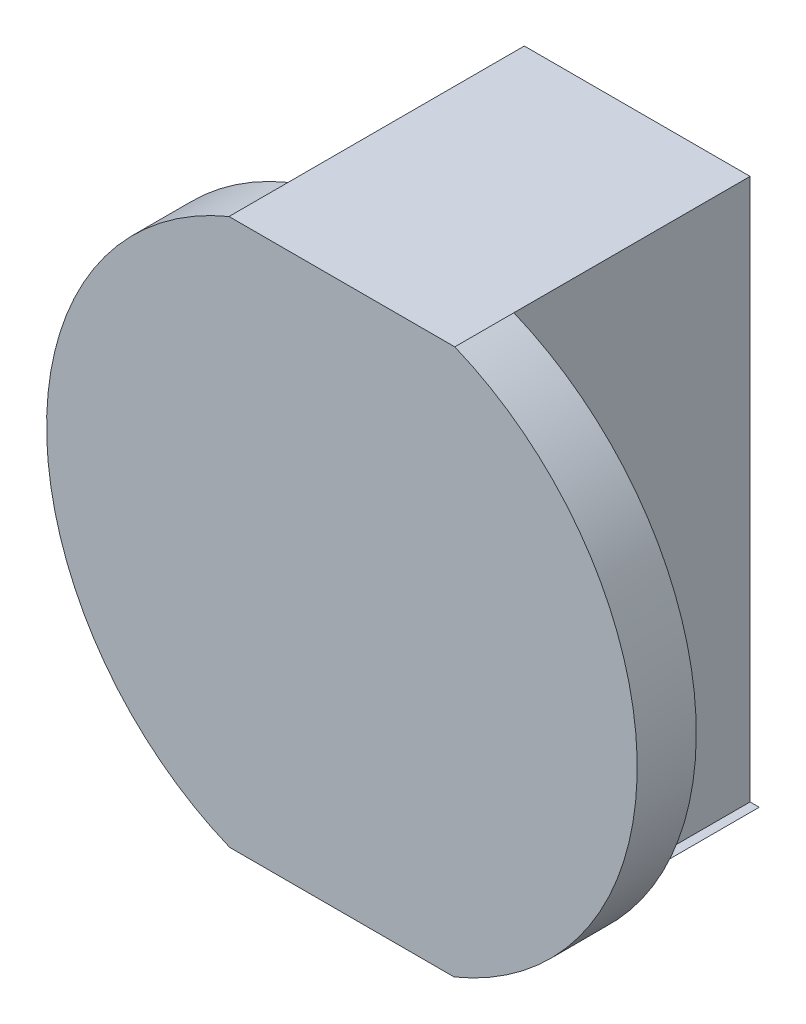
ISO-10303-21;
HEADER;
FILE_DESCRIPTION(('STEP AP214'),'2;1');
FILE_NAME('part.step','',(''),(''),'','','');
FILE_SCHEMA(('AUTOMOTIVE_DESIGN { 1 0 10303 214 1 1 1 1 }'));
ENDSEC;
DATA;
#1=APPLICATION_CONTEXT('core data for automotive mechanical design processes');
#2=APPLICATION_PROTOCOL_DEFINITION('international standard','automotive_design',2000,#1);
#3=PRODUCT_CONTEXT('',#1,'mechanical');
#4=PRODUCT('Part','Part','',(#3));
#5=PRODUCT_RELATED_PRODUCT_CATEGORY('part','',(#4));
#6=PRODUCT_DEFINITION_FORMATION('','',#4);
#7=PRODUCT_DEFINITION_CONTEXT('part definition',#1,'design');
#8=PRODUCT_DEFINITION('design','',#6,#7);
#9=PRODUCT_DEFINITION_SHAPE('','',#8);
#10=(LENGTH_UNIT() NAMED_UNIT(*) SI_UNIT(.MILLI.,.METRE.));
#11=(NAMED_UNIT(*) PLANE_ANGLE_UNIT() SI_UNIT($,.RADIAN.));
#12=(NAMED_UNIT(*) SI_UNIT($,.STERADIAN.) SOLID_ANGLE_UNIT());
#13=UNCERTAINTY_MEASURE_WITH_UNIT(LENGTH_MEASURE(1.E-05),#10,'distance_accuracy_value','');
#14=(GEOMETRIC_REPRESENTATION_CONTEXT(3) GLOBAL_UNCERTAINTY_ASSIGNED_CONTEXT((#13)) GLOBAL_UNIT_ASSIGNED_CONTEXT((#10,
#11,#12)) REPRESENTATION_CONTEXT('',''));
#15=CARTESIAN_POINT('',(0.,0.,0.));
#16=DIRECTION('',(0.,0.,1.));
#17=DIRECTION('',(1.,0.,0.));
#18=AXIS2_PLACEMENT_3D('',#15,#16,#17);
#19=CARTESIAN_POINT('',(0.,0.,57.7));
#20=DIRECTION('',(0.,0.,-1.));
#21=DIRECTION('',(-1.,0.,0.));
#22=AXIS2_PLACEMENT_3D('',#19,#20,#21);
#23=CYLINDRICAL_SURFACE('',#22,50.);
#24=CARTESIAN_POINT('',(0.,0.,50.));
#25=DIRECTION('',(0.,0.,1.));
#26=DIRECTION('',(0.,-1.,0.));
#27=AXIS2_PLACEMENT_3D('',#24,#25,#26);
#28=CIRCLE('',#27,50.);
#29=CARTESIAN_POINT('',(-19.114065052816,46.2022999119819,50.));
#30=VERTEX_POINT('',#29);
#31=CARTESIAN_POINT('',(-18.9983551919633,-46.25,50.));
#32=VERTEX_POINT('',#31);
#33=EDGE_CURVE('E102',#30,#32,#28,.T.);
#34=ORIENTED_EDGE('',*,*,#33,.F.);
#35=DIRECTION('',(0.,0.,-1.));
#36=VECTOR('',#35,1.);
#37=CARTESIAN_POINT('',(-19.114065052816,46.2022999119819,57.7));
#38=LINE('',#37,#36);
#39=CARTESIAN_POINT('',(-19.114065052816,46.2022999119819,40.));
#40=VERTEX_POINT('',#39);
#41=EDGE_CURVE('E60',#30,#40,#38,.T.);
#42=ORIENTED_EDGE('',*,*,#41,.T.);
#43=CARTESIAN_POINT('',(0.,0.,40.));
#44=DIRECTION('',(0.,0.,-1.));
#45=DIRECTION('',(-1.,0.,0.));
#46=AXIS2_PLACEMENT_3D('',#43,#44,#45);
#47=CIRCLE('',#46,50.);
#48=CARTESIAN_POINT('',(-19.114065052816,-46.2022999119819,40.));
#49=VERTEX_POINT('',#48);
#50=EDGE_CURVE('E46',#49,#40,#47,.T.);
#51=ORIENTED_EDGE('',*,*,#50,.F.);
#52=DIRECTION('',(0.,0.,-1.));
#53=VECTOR('',#52,1.);
#54=CARTESIAN_POINT('',(-19.114065052816,-46.2022999119819,57.7));
#55=LINE('',#54,#53);
#56=CARTESIAN_POINT('',(-19.114065052816,-46.2022999119818,0.));
#57=VERTEX_POINT('',#56);
#58=EDGE_CURVE('E141',#49,#57,#55,.T.);
#59=ORIENTED_EDGE('',*,*,#58,.T.);
#60=CARTESIAN_POINT('',(0.,0.,0.));
#61=DIRECTION('',(0.,0.,1.));
#62=DIRECTION('',(1.,0.,0.));
#63=AXIS2_PLACEMENT_3D('',#60,#61,#62);
#64=CIRCLE('',#63,50.);
#65=CARTESIAN_POINT('',(-18.9983551919633,-46.25,0.));
#66=VERTEX_POINT('',#65);
#67=EDGE_CURVE('E119',#57,#66,#64,.T.);
#68=ORIENTED_EDGE('',*,*,#67,.T.);
#69=DIRECTION('',(0.,0.,-1.));
#70=VECTOR('',#69,1.);
#71=CARTESIAN_POINT('',(-18.9983551919633,-46.25,57.7));
#72=LINE('',#71,#70);
#73=EDGE_CURVE('E109',#32,#66,#72,.T.);
#74=ORIENTED_EDGE('',*,*,#73,.F.);
#75=EDGE_LOOP('',(#34,#42,#51,#59,#68,#74));
#76=FACE_BOUND('',#75,.T.);
#77=ADVANCED_FACE('F39',(#76),#23,.T.);
#78=CARTESIAN_POINT('',(0.,0.,50.));
#79=DIRECTION('',(0.,0.,1.));
#80=DIRECTION('',(0.,-1.,0.));
#81=AXIS2_PLACEMENT_3D('',#78,#79,#80);
#82=CIRCLE('',#81,50.);
#83=CARTESIAN_POINT('',(18.9983551919633,-46.25,50.));
#84=VERTEX_POINT('',#83);
#85=CARTESIAN_POINT('',(19.114065052816,46.2022999119819,50.));
#86=VERTEX_POINT('',#85);
#87=EDGE_CURVE('E52',#84,#86,#82,.T.);
#88=ORIENTED_EDGE('',*,*,#87,.F.);
#89=DIRECTION('',(0.,0.,-1.));
#90=VECTOR('',#89,1.);
#91=CARTESIAN_POINT('',(18.9983551919633,-46.25,57.7));
#92=LINE('',#91,#90);
#93=CARTESIAN_POINT('',(18.9983551919633,-46.25,0.));
#94=VERTEX_POINT('',#93);
#95=EDGE_CURVE('E157',#94,#84,#92,.F.);
#96=ORIENTED_EDGE('',*,*,#95,.F.);
#97=CARTESIAN_POINT('',(20.6641745876785,-45.5301206742299,0.));
#98=VERTEX_POINT('',#97);
#99=EDGE_CURVE('E115',#94,#98,#64,.T.);
#100=ORIENTED_EDGE('',*,*,#99,.T.);
#101=DIRECTION('',(0.,0.,-1.));
#102=VECTOR('',#101,1.);
#103=CARTESIAN_POINT('',(20.6641745876785,-45.5301206742299,57.7));
#104=LINE('',#103,#102);
#105=CARTESIAN_POINT('',(20.6641745876785,-45.5301206742299,40.));
#106=VERTEX_POINT('',#105);
#107=EDGE_CURVE('E145',#98,#106,#104,.F.);
#108=ORIENTED_EDGE('',*,*,#107,.T.);
#109=CARTESIAN_POINT('',(0.,0.,40.));
#110=DIRECTION('',(0.,0.,1.));
#111=DIRECTION('',(1.,0.,0.));
#112=AXIS2_PLACEMENT_3D('',#109,#110,#111);
#113=CIRCLE('',#112,50.);
#114=CARTESIAN_POINT('',(19.114065052816,46.2022999119819,40.));
#115=VERTEX_POINT('',#114);
#116=EDGE_CURVE('E133',#106,#115,#113,.T.);
#117=ORIENTED_EDGE('',*,*,#116,.T.);
#118=DIRECTION('',(0.,0.,-1.));
#119=VECTOR('',#118,1.);
#120=CARTESIAN_POINT('',(19.114065052816,46.2022999119819,57.7));
#121=LINE('',#120,#119);
#122=EDGE_CURVE('E121',#115,#86,#121,.F.);
#123=ORIENTED_EDGE('',*,*,#122,.T.);
#124=EDGE_LOOP('',(#88,#96,#100,#108,#117,#123));
#125=FACE_BOUND('',#124,.T.);
#126=ADVANCED_FACE('F159',(#125),#23,.T.);
#127=CARTESIAN_POINT('',(-53.3744857867374,-46.25,0.));
#128=DIRECTION('',(0.,-1.,0.));
#129=DIRECTION('',(0.,0.,-1.));
#130=AXIS2_PLACEMENT_3D('',#127,#128,#129);
#131=PLANE('',#130);
#132=ORIENTED_EDGE('',*,*,#95,.T.);
#133=DIRECTION('',(-1.,0.,0.));
#134=VECTOR('',#133,1.);
#135=CARTESIAN_POINT('',(-53.3744857867374,-46.25,50.));
#136=LINE('',#135,#134);
#137=EDGE_CURVE('E177',#84,#32,#136,.T.);
#138=ORIENTED_EDGE('',*,*,#137,.T.);
#139=ORIENTED_EDGE('',*,*,#73,.T.);
#140=DIRECTION('',(1.,0.,0.));
#141=VECTOR('',#140,1.);
#142=CARTESIAN_POINT('',(0.,-46.25,0.));
#143=LINE('',#142,#141);
#144=EDGE_CURVE('E125',#66,#94,#143,.T.);
#145=ORIENTED_EDGE('',*,*,#144,.T.);
#146=EDGE_LOOP('',(#132,#138,#139,#145));
#147=FACE_BOUND('',#146,.T.);
#148=ADVANCED_FACE('F156',(#147),#131,.T.);
#149=CARTESIAN_POINT('',(-43.6629237714477,46.2022999119819,0.));
#150=DIRECTION('',(0.,-1.,0.));
#151=DIRECTION('',(0.,0.,-1.));
#152=AXIS2_PLACEMENT_3D('',#149,#150,#151);
#153=PLANE('',#152);
#154=DIRECTION('',(-1.,0.,0.));
#155=VECTOR('',#154,1.);
#156=CARTESIAN_POINT('',(-43.6629237714477,46.2022999119819,50.));
#157=LINE('',#156,#155);
#158=EDGE_CURVE('E11',#86,#30,#157,.T.);
#159=ORIENTED_EDGE('',*,*,#158,.F.);
#160=ORIENTED_EDGE('',*,*,#122,.F.);
#161=CARTESIAN_POINT('',(19.114065052816,46.2022999119819,0.));
#162=VERTEX_POINT('',#161);
#163=EDGE_CURVE('E116',#162,#115,#121,.F.);
#164=ORIENTED_EDGE('',*,*,#163,.F.);
#165=DIRECTION('',(1.,0.,0.));
#166=VECTOR('',#165,1.);
#167=CARTESIAN_POINT('',(0.,46.2022999119819,0.));
#168=LINE('',#167,#166);
#169=CARTESIAN_POINT('',(-19.114065052816,46.2022999119819,0.));
#170=VERTEX_POINT('',#169);
#171=EDGE_CURVE('E127',#170,#162,#168,.T.);
#172=ORIENTED_EDGE('',*,*,#171,.F.);
#173=DIRECTION('',(0.,0.,-1.));
#174=VECTOR('',#173,1.);
#175=CARTESIAN_POINT('',(-19.114065052816,46.2022999119819,40.));
#176=LINE('',#175,#174);
#177=EDGE_CURVE('E110',#40,#170,#176,.T.);
#178=ORIENTED_EDGE('',*,*,#177,.F.);
#179=ORIENTED_EDGE('',*,*,#41,.F.);
#180=EDGE_LOOP('',(#159,#160,#164,#172,#178,#179));
#181=FACE_BOUND('',#180,.T.);
#182=ADVANCED_FACE('F113',(#181),#153,.F.);
#183=CARTESIAN_POINT('',(0.,0.,0.));
#184=DIRECTION('',(0.,0.,1.));
#185=DIRECTION('',(1.,0.,0.));
#186=AXIS2_PLACEMENT_3D('',#183,#184,#185);
#187=PLANE('',#186);
#188=ORIENTED_EDGE('',*,*,#171,.T.);
#189=DIRECTION('',(0.,1.,0.));
#190=VECTOR('',#189,1.);
#191=CARTESIAN_POINT('',(19.114065052816,46.2022999119819,0.));
#192=LINE('',#191,#190);
#193=CARTESIAN_POINT('',(19.114065052816,-45.5301206742299,0.));
#194=VERTEX_POINT('',#193);
#195=EDGE_CURVE('E166',#194,#162,#192,.T.);
#196=ORIENTED_EDGE('',*,*,#195,.F.);
#197=DIRECTION('',(1.,0.,0.));
#198=VECTOR('',#197,1.);
#199=CARTESIAN_POINT('',(0.,-45.5301206742299,0.));
#200=LINE('',#199,#198);
#201=EDGE_CURVE('E130',#194,#98,#200,.T.);
#202=ORIENTED_EDGE('',*,*,#201,.T.);
#203=ORIENTED_EDGE('',*,*,#99,.F.);
#204=ORIENTED_EDGE('',*,*,#144,.F.);
#205=ORIENTED_EDGE('',*,*,#67,.F.);
#206=DIRECTION('',(0.,-1.,0.));
#207=VECTOR('',#206,1.);
#208=CARTESIAN_POINT('',(-19.114065052816,46.2022999119819,0.));
#209=LINE('',#208,#207);
#210=EDGE_CURVE('E151',#170,#57,#209,.T.);
#211=ORIENTED_EDGE('',*,*,#210,.F.);
#212=EDGE_LOOP('',(#188,#196,#202,#203,#204,#205,#211));
#213=FACE_BOUND('',#212,.T.);
#214=ADVANCED_FACE('F150',(#213),#187,.F.);
#215=CARTESIAN_POINT('',(0.,0.,40.));
#216=DIRECTION('',(0.,0.,-1.));
#217=DIRECTION('',(-1.,0.,0.));
#218=AXIS2_PLACEMENT_3D('',#215,#216,#217);
#219=PLANE('',#218);
#220=ORIENTED_EDGE('',*,*,#50,.T.);
#221=DIRECTION('',(0.,-1.,0.));
#222=VECTOR('',#221,1.);
#223=CARTESIAN_POINT('',(-19.114065052816,46.2022999119819,40.));
#224=LINE('',#223,#222);
#225=EDGE_CURVE('E139',#40,#49,#224,.T.);
#226=ORIENTED_EDGE('',*,*,#225,.T.);
#227=EDGE_LOOP('',(#220,#226));
#228=FACE_BOUND('',#227,.T.);
#229=ADVANCED_FACE('F138',(#228),#219,.T.);
#230=CARTESIAN_POINT('',(-19.114065052816,46.2022999119819,40.));
#231=DIRECTION('',(1.,0.,0.));
#232=DIRECTION('',(0.,0.,-1.));
#233=AXIS2_PLACEMENT_3D('',#230,#231,#232);
#234=PLANE('',#233);
#235=ORIENTED_EDGE('',*,*,#225,.F.);
#236=ORIENTED_EDGE('',*,*,#177,.T.);
#237=ORIENTED_EDGE('',*,*,#210,.T.);
#238=ORIENTED_EDGE('',*,*,#58,.F.);
#239=EDGE_LOOP('',(#235,#236,#237,#238));
#240=FACE_BOUND('',#239,.T.);
#241=ADVANCED_FACE('F196',(#240),#234,.F.);
#242=CARTESIAN_POINT('',(0.,0.,40.));
#243=DIRECTION('',(0.,0.,1.));
#244=DIRECTION('',(1.,0.,0.));
#245=AXIS2_PLACEMENT_3D('',#242,#243,#244);
#246=PLANE('',#245);
#247=DIRECTION('',(-1.,0.,0.));
#248=VECTOR('',#247,1.);
#249=CARTESIAN_POINT('',(19.114065052816,-45.5301206742299,40.));
#250=LINE('',#249,#248);
#251=CARTESIAN_POINT('',(19.114065052816,-45.5301206742299,40.));
#252=VERTEX_POINT('',#251);
#253=EDGE_CURVE('E170',#106,#252,#250,.T.);
#254=ORIENTED_EDGE('',*,*,#253,.T.);
#255=DIRECTION('',(0.,1.,0.));
#256=VECTOR('',#255,1.);
#257=CARTESIAN_POINT('',(19.114065052816,46.2022999119819,40.));
#258=LINE('',#257,#256);
#259=EDGE_CURVE('E172',#252,#115,#258,.T.);
#260=ORIENTED_EDGE('',*,*,#259,.T.);
#261=ORIENTED_EDGE('',*,*,#116,.F.);
#262=EDGE_LOOP('',(#254,#260,#261));
#263=FACE_BOUND('',#262,.T.);
#264=ADVANCED_FACE('F180',(#263),#246,.F.);
#265=CARTESIAN_POINT('',(19.114065052816,-45.5301206742299,40.));
#266=DIRECTION('',(0.,-1.,0.));
#267=DIRECTION('',(0.,0.,-1.));
#268=AXIS2_PLACEMENT_3D('',#265,#266,#267);
#269=PLANE('',#268);
#270=ORIENTED_EDGE('',*,*,#201,.F.);
#271=DIRECTION('',(0.,0.,-1.));
#272=VECTOR('',#271,1.);
#273=CARTESIAN_POINT('',(19.114065052816,-45.5301206742299,40.));
#274=LINE('',#273,#272);
#275=EDGE_CURVE('E146',#252,#194,#274,.T.);
#276=ORIENTED_EDGE('',*,*,#275,.F.);
#277=ORIENTED_EDGE('',*,*,#253,.F.);
#278=ORIENTED_EDGE('',*,*,#107,.F.);
#279=EDGE_LOOP('',(#270,#276,#277,#278));
#280=FACE_BOUND('',#279,.T.);
#281=ADVANCED_FACE('F188',(#280),#269,.F.);
#282=CARTESIAN_POINT('',(19.114065052816,46.2022999119819,40.));
#283=DIRECTION('',(-1.,0.,0.));
#284=DIRECTION('',(0.,0.,1.));
#285=AXIS2_PLACEMENT_3D('',#282,#283,#284);
#286=PLANE('',#285);
#287=ORIENTED_EDGE('',*,*,#195,.T.);
#288=ORIENTED_EDGE('',*,*,#163,.T.);
#289=ORIENTED_EDGE('',*,*,#259,.F.);
#290=ORIENTED_EDGE('',*,*,#275,.T.);
#291=EDGE_LOOP('',(#287,#288,#289,#290));
#292=FACE_BOUND('',#291,.T.);
#293=ADVANCED_FACE('F186',(#292),#286,.F.);
#294=CARTESIAN_POINT('',(-54.114065052816,46.2022999119819,50.));
#295=DIRECTION('',(0.,0.,1.));
#296=DIRECTION('',(0.,-1.,0.));
#297=AXIS2_PLACEMENT_3D('',#294,#295,#296);
#298=PLANE('',#297);
#299=ORIENTED_EDGE('',*,*,#33,.T.);
#300=ORIENTED_EDGE('',*,*,#137,.F.);
#301=ORIENTED_EDGE('',*,*,#87,.T.);
#302=ORIENTED_EDGE('',*,*,#158,.T.);
#303=EDGE_LOOP('',(#299,#300,#301,#302));
#304=FACE_BOUND('',#303,.T.);
#305=ADVANCED_FACE('F101',(#304),#298,.T.);
#306=CLOSED_SHELL('',(#77,#126,#148,#182,#214,#229,#241,#264,#281,#293,#305));
#307=MANIFOLD_SOLID_BREP('B2',#306);
#308=ADVANCED_BREP_SHAPE_REPRESENTATION('',(#18,#307),#14);
#309=SHAPE_DEFINITION_REPRESENTATION(#9,#308);
ENDSEC;
END-ISO-10303-21;
